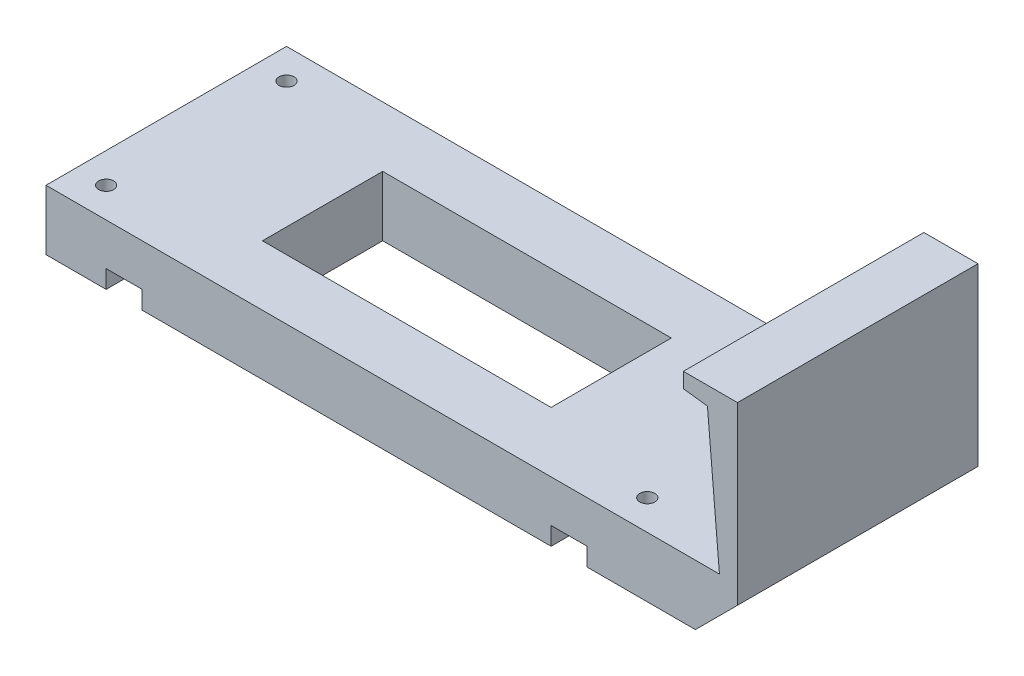
ISO-10303-21;
HEADER;
FILE_DESCRIPTION(('STEP AP214'),'2;1');
FILE_NAME('part.step','',(''),(''),'','','');
FILE_SCHEMA(('AUTOMOTIVE_DESIGN { 1 0 10303 214 1 1 1 1 }'));
ENDSEC;
DATA;
#1=APPLICATION_CONTEXT('core data for automotive mechanical design processes');
#2=APPLICATION_PROTOCOL_DEFINITION('international standard','automotive_design',2000,#1);
#3=PRODUCT_CONTEXT('',#1,'mechanical');
#4=PRODUCT('Part','Part','',(#3));
#5=PRODUCT_RELATED_PRODUCT_CATEGORY('part','',(#4));
#6=PRODUCT_DEFINITION_FORMATION('','',#4);
#7=PRODUCT_DEFINITION_CONTEXT('part definition',#1,'design');
#8=PRODUCT_DEFINITION('design','',#6,#7);
#9=PRODUCT_DEFINITION_SHAPE('','',#8);
#10=(LENGTH_UNIT() NAMED_UNIT(*) SI_UNIT(.MILLI.,.METRE.));
#11=(NAMED_UNIT(*) PLANE_ANGLE_UNIT() SI_UNIT($,.RADIAN.));
#12=(NAMED_UNIT(*) SI_UNIT($,.STERADIAN.) SOLID_ANGLE_UNIT());
#13=UNCERTAINTY_MEASURE_WITH_UNIT(LENGTH_MEASURE(1.E-05),#10,'distance_accuracy_value','');
#14=(GEOMETRIC_REPRESENTATION_CONTEXT(3) GLOBAL_UNCERTAINTY_ASSIGNED_CONTEXT((#13)) GLOBAL_UNIT_ASSIGNED_CONTEXT((#10,
#11,#12)) REPRESENTATION_CONTEXT('',''));
#15=CARTESIAN_POINT('',(0.,0.,0.));
#16=DIRECTION('',(0.,0.,1.));
#17=DIRECTION('',(1.,0.,0.));
#18=AXIS2_PLACEMENT_3D('',#15,#16,#17);
#19=CARTESIAN_POINT('',(0.,10.,40.));
#20=DIRECTION('',(1.,0.,0.));
#21=DIRECTION('',(0.,1.,0.));
#22=AXIS2_PLACEMENT_3D('',#19,#20,#21);
#23=PLANE('',#22);
#24=DIRECTION('',(0.,-1.,0.));
#25=VECTOR('',#24,1.);
#26=CARTESIAN_POINT('',(0.,10.,0.));
#27=LINE('',#26,#25);
#28=CARTESIAN_POINT('',(0.,10.,0.));
#29=VERTEX_POINT('',#28);
#30=CARTESIAN_POINT('',(0.,0.,0.));
#31=VERTEX_POINT('',#30);
#32=EDGE_CURVE('E296',#29,#31,#27,.T.);
#33=ORIENTED_EDGE('',*,*,#32,.T.);
#34=DIRECTION('',(0.,0.,-1.));
#35=VECTOR('',#34,1.);
#36=CARTESIAN_POINT('',(0.,0.,40.));
#37=LINE('',#36,#35);
#38=CARTESIAN_POINT('',(0.,0.,40.));
#39=VERTEX_POINT('',#38);
#40=EDGE_CURVE('E11',#39,#31,#37,.T.);
#41=ORIENTED_EDGE('',*,*,#40,.F.);
#42=DIRECTION('',(0.,-1.,0.));
#43=VECTOR('',#42,1.);
#44=CARTESIAN_POINT('',(0.,10.,40.));
#45=LINE('',#44,#43);
#46=CARTESIAN_POINT('',(0.,10.,40.));
#47=VERTEX_POINT('',#46);
#48=EDGE_CURVE('E297',#47,#39,#45,.T.);
#49=ORIENTED_EDGE('',*,*,#48,.F.);
#50=DIRECTION('',(0.,0.,-1.));
#51=VECTOR('',#50,1.);
#52=CARTESIAN_POINT('',(0.,10.,40.));
#53=LINE('',#52,#51);
#54=EDGE_CURVE('E181',#47,#29,#53,.T.);
#55=ORIENTED_EDGE('',*,*,#54,.T.);
#56=EDGE_LOOP('',(#33,#41,#49,#55));
#57=FACE_BOUND('',#56,.T.);
#58=ADVANCED_FACE('F33',(#57),#23,.F.);
#59=CARTESIAN_POINT('',(0.,0.,40.));
#60=DIRECTION('',(0.,1.,0.));
#61=DIRECTION('',(0.,0.,1.));
#62=AXIS2_PLACEMENT_3D('',#59,#60,#61);
#63=PLANE('',#62);
#64=CARTESIAN_POINT('',(5.,0.,5.));
#65=DIRECTION('',(0.,-1.,0.));
#66=DIRECTION('',(0.,0.,-1.));
#67=AXIS2_PLACEMENT_3D('',#64,#65,#66);
#68=CIRCLE('',#67,1.25);
#69=CARTESIAN_POINT('',(5.,0.,3.75));
#70=VERTEX_POINT('',#69);
#71=EDGE_CURVE('E251',#70,#70,#68,.T.);
#72=ORIENTED_EDGE('',*,*,#71,.F.);
#73=EDGE_LOOP('',(#72));
#74=FACE_BOUND('',#73,.T.);
#75=CARTESIAN_POINT('',(5.,0.,35.));
#76=DIRECTION('',(0.,-1.,0.));
#77=DIRECTION('',(0.,0.,-1.));
#78=AXIS2_PLACEMENT_3D('',#75,#76,#77);
#79=CIRCLE('',#78,1.25);
#80=CARTESIAN_POINT('',(5.,0.,33.75));
#81=VERTEX_POINT('',#80);
#82=EDGE_CURVE('E258',#81,#81,#79,.T.);
#83=ORIENTED_EDGE('',*,*,#82,.F.);
#84=EDGE_LOOP('',(#83));
#85=FACE_BOUND('',#84,.T.);
#86=DIRECTION('',(1.,0.,0.));
#87=VECTOR('',#86,1.);
#88=CARTESIAN_POINT('',(0.,0.,0.));
#89=LINE('',#88,#87);
#90=CARTESIAN_POINT('',(10.,0.,0.));
#91=VERTEX_POINT('',#90);
#92=EDGE_CURVE('E319',#31,#91,#89,.T.);
#93=ORIENTED_EDGE('',*,*,#92,.T.);
#94=DIRECTION('',(0.,0.,-1.));
#95=VECTOR('',#94,1.);
#96=CARTESIAN_POINT('',(10.,0.,40.));
#97=LINE('',#96,#95);
#98=CARTESIAN_POINT('',(10.,0.,40.));
#99=VERTEX_POINT('',#98);
#100=EDGE_CURVE('E40',#99,#91,#97,.T.);
#101=ORIENTED_EDGE('',*,*,#100,.F.);
#102=DIRECTION('',(1.,0.,0.));
#103=VECTOR('',#102,1.);
#104=CARTESIAN_POINT('',(0.,0.,40.));
#105=LINE('',#104,#103);
#106=EDGE_CURVE('E299',#39,#99,#105,.T.);
#107=ORIENTED_EDGE('',*,*,#106,.F.);
#108=ORIENTED_EDGE('',*,*,#40,.T.);
#109=EDGE_LOOP('',(#93,#101,#107,#108));
#110=FACE_BOUND('',#109,.T.);
#111=ADVANCED_FACE('F384',(#74,#85,#110),#63,.F.);
#112=CARTESIAN_POINT('',(10.,0.,40.));
#113=DIRECTION('',(-1.,0.,0.));
#114=DIRECTION('',(0.,0.,1.));
#115=AXIS2_PLACEMENT_3D('',#112,#113,#114);
#116=PLANE('',#115);
#117=DIRECTION('',(0.,1.,0.));
#118=VECTOR('',#117,1.);
#119=CARTESIAN_POINT('',(10.,0.,0.));
#120=LINE('',#119,#118);
#121=CARTESIAN_POINT('',(10.,3.,0.));
#122=VERTEX_POINT('',#121);
#123=EDGE_CURVE('E321',#91,#122,#120,.T.);
#124=ORIENTED_EDGE('',*,*,#123,.T.);
#125=DIRECTION('',(0.,0.,-1.));
#126=VECTOR('',#125,1.);
#127=CARTESIAN_POINT('',(10.,3.,40.));
#128=LINE('',#127,#126);
#129=CARTESIAN_POINT('',(10.,3.,40.));
#130=VERTEX_POINT('',#129);
#131=EDGE_CURVE('E357',#130,#122,#128,.T.);
#132=ORIENTED_EDGE('',*,*,#131,.F.);
#133=DIRECTION('',(0.,1.,0.));
#134=VECTOR('',#133,1.);
#135=CARTESIAN_POINT('',(10.,0.,40.));
#136=LINE('',#135,#134);
#137=EDGE_CURVE('E302',#99,#130,#136,.T.);
#138=ORIENTED_EDGE('',*,*,#137,.F.);
#139=ORIENTED_EDGE('',*,*,#100,.T.);
#140=EDGE_LOOP('',(#124,#132,#138,#139));
#141=FACE_BOUND('',#140,.T.);
#142=ADVANCED_FACE('F364',(#141),#116,.F.);
#143=CARTESIAN_POINT('',(10.,3.,40.));
#144=DIRECTION('',(0.,1.,0.));
#145=DIRECTION('',(0.,0.,1.));
#146=AXIS2_PLACEMENT_3D('',#143,#144,#145);
#147=PLANE('',#146);
#148=DIRECTION('',(1.,0.,0.));
#149=VECTOR('',#148,1.);
#150=CARTESIAN_POINT('',(10.,3.,0.));
#151=LINE('',#150,#149);
#152=CARTESIAN_POINT('',(16.,3.,0.));
#153=VERTEX_POINT('',#152);
#154=EDGE_CURVE('E323',#122,#153,#151,.T.);
#155=ORIENTED_EDGE('',*,*,#154,.T.);
#156=DIRECTION('',(0.,0.,-1.));
#157=VECTOR('',#156,1.);
#158=CARTESIAN_POINT('',(16.,3.,40.));
#159=LINE('',#158,#157);
#160=CARTESIAN_POINT('',(16.,3.,40.));
#161=VERTEX_POINT('',#160);
#162=EDGE_CURVE('E354',#161,#153,#159,.T.);
#163=ORIENTED_EDGE('',*,*,#162,.F.);
#164=DIRECTION('',(1.,0.,0.));
#165=VECTOR('',#164,1.);
#166=CARTESIAN_POINT('',(10.,3.,40.));
#167=LINE('',#166,#165);
#168=EDGE_CURVE('E304',#130,#161,#167,.T.);
#169=ORIENTED_EDGE('',*,*,#168,.F.);
#170=ORIENTED_EDGE('',*,*,#131,.T.);
#171=EDGE_LOOP('',(#155,#163,#169,#170));
#172=FACE_BOUND('',#171,.T.);
#173=ADVANCED_FACE('F375',(#172),#147,.F.);
#174=CARTESIAN_POINT('',(16.,3.,40.));
#175=DIRECTION('',(1.,0.,0.));
#176=DIRECTION('',(0.,0.,-1.));
#177=AXIS2_PLACEMENT_3D('',#174,#175,#176);
#178=PLANE('',#177);
#179=DIRECTION('',(0.,-1.,0.));
#180=VECTOR('',#179,1.);
#181=CARTESIAN_POINT('',(16.,3.,0.));
#182=LINE('',#181,#180);
#183=CARTESIAN_POINT('',(16.,0.,0.));
#184=VERTEX_POINT('',#183);
#185=EDGE_CURVE('E325',#153,#184,#182,.T.);
#186=ORIENTED_EDGE('',*,*,#185,.T.);
#187=DIRECTION('',(0.,0.,-1.));
#188=VECTOR('',#187,1.);
#189=CARTESIAN_POINT('',(16.,0.,40.));
#190=LINE('',#189,#188);
#191=CARTESIAN_POINT('',(16.,0.,40.));
#192=VERTEX_POINT('',#191);
#193=EDGE_CURVE('E351',#192,#184,#190,.T.);
#194=ORIENTED_EDGE('',*,*,#193,.F.);
#195=DIRECTION('',(0.,-1.,0.));
#196=VECTOR('',#195,1.);
#197=CARTESIAN_POINT('',(16.,3.,40.));
#198=LINE('',#197,#196);
#199=EDGE_CURVE('E306',#161,#192,#198,.T.);
#200=ORIENTED_EDGE('',*,*,#199,.F.);
#201=ORIENTED_EDGE('',*,*,#162,.T.);
#202=EDGE_LOOP('',(#186,#194,#200,#201));
#203=FACE_BOUND('',#202,.T.);
#204=ADVANCED_FACE('F379',(#203),#178,.F.);
#205=CARTESIAN_POINT('',(16.,0.,40.));
#206=DIRECTION('',(0.,1.,0.));
#207=DIRECTION('',(0.,0.,1.));
#208=AXIS2_PLACEMENT_3D('',#205,#206,#207);
#209=PLANE('',#208);
#210=DIRECTION('',(1.,0.,0.));
#211=VECTOR('',#210,1.);
#212=CARTESIAN_POINT('',(26.,0.,10.));
#213=LINE('',#212,#211);
#214=CARTESIAN_POINT('',(26.,0.,10.));
#215=VERTEX_POINT('',#214);
#216=CARTESIAN_POINT('',(74.,0.,10.));
#217=VERTEX_POINT('',#216);
#218=EDGE_CURVE('E269',#215,#217,#213,.T.);
#219=ORIENTED_EDGE('',*,*,#218,.F.);
#220=DIRECTION('',(0.,0.,-1.));
#221=VECTOR('',#220,1.);
#222=CARTESIAN_POINT('',(26.,0.,10.));
#223=LINE('',#222,#221);
#224=CARTESIAN_POINT('',(26.,0.,30.));
#225=VERTEX_POINT('',#224);
#226=EDGE_CURVE('E272',#225,#215,#223,.T.);
#227=ORIENTED_EDGE('',*,*,#226,.F.);
#228=DIRECTION('',(-1.,0.,0.));
#229=VECTOR('',#228,1.);
#230=CARTESIAN_POINT('',(26.,0.,30.));
#231=LINE('',#230,#229);
#232=CARTESIAN_POINT('',(74.,0.,30.));
#233=VERTEX_POINT('',#232);
#234=EDGE_CURVE('E288',#233,#225,#231,.T.);
#235=ORIENTED_EDGE('',*,*,#234,.F.);
#236=DIRECTION('',(0.,0.,1.));
#237=VECTOR('',#236,1.);
#238=CARTESIAN_POINT('',(74.,0.,10.));
#239=LINE('',#238,#237);
#240=EDGE_CURVE('E47',#217,#233,#239,.T.);
#241=ORIENTED_EDGE('',*,*,#240,.F.);
#242=EDGE_LOOP('',(#219,#227,#235,#241));
#243=FACE_BOUND('',#242,.T.);
#244=DIRECTION('',(1.,0.,0.));
#245=VECTOR('',#244,1.);
#246=CARTESIAN_POINT('',(16.,0.,0.));
#247=LINE('',#246,#245);
#248=CARTESIAN_POINT('',(84.,0.,0.));
#249=VERTEX_POINT('',#248);
#250=EDGE_CURVE('E327',#184,#249,#247,.T.);
#251=ORIENTED_EDGE('',*,*,#250,.T.);
#252=DIRECTION('',(0.,0.,-1.));
#253=VECTOR('',#252,1.);
#254=CARTESIAN_POINT('',(84.,0.,40.));
#255=LINE('',#254,#253);
#256=CARTESIAN_POINT('',(84.,0.,40.));
#257=VERTEX_POINT('',#256);
#258=EDGE_CURVE('E348',#257,#249,#255,.T.);
#259=ORIENTED_EDGE('',*,*,#258,.F.);
#260=DIRECTION('',(1.,0.,0.));
#261=VECTOR('',#260,1.);
#262=CARTESIAN_POINT('',(16.,0.,40.));
#263=LINE('',#262,#261);
#264=EDGE_CURVE('E308',#192,#257,#263,.T.);
#265=ORIENTED_EDGE('',*,*,#264,.F.);
#266=ORIENTED_EDGE('',*,*,#193,.T.);
#267=EDGE_LOOP('',(#251,#259,#265,#266));
#268=FACE_BOUND('',#267,.T.);
#269=ADVANCED_FACE('F425',(#243,#268),#209,.F.);
#270=CARTESIAN_POINT('',(84.,0.,40.));
#271=DIRECTION('',(-1.,0.,0.));
#272=DIRECTION('',(0.,0.,1.));
#273=AXIS2_PLACEMENT_3D('',#270,#271,#272);
#274=PLANE('',#273);
#275=DIRECTION('',(0.,1.,0.));
#276=VECTOR('',#275,1.);
#277=CARTESIAN_POINT('',(84.,0.,0.));
#278=LINE('',#277,#276);
#279=CARTESIAN_POINT('',(84.,3.,0.));
#280=VERTEX_POINT('',#279);
#281=EDGE_CURVE('E329',#249,#280,#278,.T.);
#282=ORIENTED_EDGE('',*,*,#281,.T.);
#283=DIRECTION('',(0.,0.,-1.));
#284=VECTOR('',#283,1.);
#285=CARTESIAN_POINT('',(84.,3.,40.));
#286=LINE('',#285,#284);
#287=CARTESIAN_POINT('',(84.,3.,40.));
#288=VERTEX_POINT('',#287);
#289=EDGE_CURVE('E345',#288,#280,#286,.T.);
#290=ORIENTED_EDGE('',*,*,#289,.F.);
#291=DIRECTION('',(0.,1.,0.));
#292=VECTOR('',#291,1.);
#293=CARTESIAN_POINT('',(84.,0.,40.));
#294=LINE('',#293,#292);
#295=EDGE_CURVE('E310',#257,#288,#294,.T.);
#296=ORIENTED_EDGE('',*,*,#295,.F.);
#297=ORIENTED_EDGE('',*,*,#258,.T.);
#298=EDGE_LOOP('',(#282,#290,#296,#297));
#299=FACE_BOUND('',#298,.T.);
#300=ADVANCED_FACE('F423',(#299),#274,.F.);
#301=CARTESIAN_POINT('',(84.,3.,40.));
#302=DIRECTION('',(0.,1.,0.));
#303=DIRECTION('',(-1.,0.,0.));
#304=AXIS2_PLACEMENT_3D('',#301,#302,#303);
#305=PLANE('',#304);
#306=DIRECTION('',(1.,0.,0.));
#307=VECTOR('',#306,1.);
#308=CARTESIAN_POINT('',(84.,3.,0.));
#309=LINE('',#308,#307);
#310=CARTESIAN_POINT('',(90.,3.,0.));
#311=VERTEX_POINT('',#310);
#312=EDGE_CURVE('E331',#280,#311,#309,.T.);
#313=ORIENTED_EDGE('',*,*,#312,.T.);
#314=DIRECTION('',(0.,0.,-1.));
#315=VECTOR('',#314,1.);
#316=CARTESIAN_POINT('',(90.,3.,40.));
#317=LINE('',#316,#315);
#318=CARTESIAN_POINT('',(90.,3.,40.));
#319=VERTEX_POINT('',#318);
#320=EDGE_CURVE('E342',#319,#311,#317,.T.);
#321=ORIENTED_EDGE('',*,*,#320,.F.);
#322=DIRECTION('',(1.,0.,0.));
#323=VECTOR('',#322,1.);
#324=CARTESIAN_POINT('',(84.,3.,40.));
#325=LINE('',#324,#323);
#326=EDGE_CURVE('E312',#288,#319,#325,.T.);
#327=ORIENTED_EDGE('',*,*,#326,.F.);
#328=ORIENTED_EDGE('',*,*,#289,.T.);
#329=EDGE_LOOP('',(#313,#321,#327,#328));
#330=FACE_BOUND('',#329,.T.);
#331=ADVANCED_FACE('F419',(#330),#305,.F.);
#332=CARTESIAN_POINT('',(90.,3.,40.));
#333=DIRECTION('',(1.,0.,0.));
#334=DIRECTION('',(0.,0.,-1.));
#335=AXIS2_PLACEMENT_3D('',#332,#333,#334);
#336=PLANE('',#335);
#337=DIRECTION('',(0.,-1.,0.));
#338=VECTOR('',#337,1.);
#339=CARTESIAN_POINT('',(90.,3.,0.));
#340=LINE('',#339,#338);
#341=CARTESIAN_POINT('',(90.,0.,0.));
#342=VERTEX_POINT('',#341);
#343=EDGE_CURVE('E333',#311,#342,#340,.T.);
#344=ORIENTED_EDGE('',*,*,#343,.T.);
#345=DIRECTION('',(0.,0.,-1.));
#346=VECTOR('',#345,1.);
#347=CARTESIAN_POINT('',(90.,0.,40.));
#348=LINE('',#347,#346);
#349=CARTESIAN_POINT('',(90.,0.,40.));
#350=VERTEX_POINT('',#349);
#351=EDGE_CURVE('E339',#350,#342,#348,.T.);
#352=ORIENTED_EDGE('',*,*,#351,.F.);
#353=DIRECTION('',(0.,-1.,0.));
#354=VECTOR('',#353,1.);
#355=CARTESIAN_POINT('',(90.,3.,40.));
#356=LINE('',#355,#354);
#357=EDGE_CURVE('E314',#319,#350,#356,.T.);
#358=ORIENTED_EDGE('',*,*,#357,.F.);
#359=ORIENTED_EDGE('',*,*,#320,.T.);
#360=EDGE_LOOP('',(#344,#352,#358,#359));
#361=FACE_BOUND('',#360,.T.);
#362=ADVANCED_FACE('F414',(#361),#336,.F.);
#363=CARTESIAN_POINT('',(90.,0.,40.));
#364=DIRECTION('',(0.,1.,0.));
#365=DIRECTION('',(0.,0.,1.));
#366=AXIS2_PLACEMENT_3D('',#363,#364,#365);
#367=PLANE('',#366);
#368=CARTESIAN_POINT('',(95.,0.,35.));
#369=DIRECTION('',(0.,-1.,0.));
#370=DIRECTION('',(0.,0.,-1.));
#371=AXIS2_PLACEMENT_3D('',#368,#369,#370);
#372=CIRCLE('',#371,1.25);
#373=CARTESIAN_POINT('',(95.,0.,33.75));
#374=VERTEX_POINT('',#373);
#375=EDGE_CURVE('E250',#374,#374,#372,.T.);
#376=ORIENTED_EDGE('',*,*,#375,.F.);
#377=EDGE_LOOP('',(#376));
#378=FACE_BOUND('',#377,.T.);
#379=CARTESIAN_POINT('',(95.,0.,5.));
#380=DIRECTION('',(0.,-1.,0.));
#381=DIRECTION('',(0.,0.,-1.));
#382=AXIS2_PLACEMENT_3D('',#379,#380,#381);
#383=CIRCLE('',#382,1.25);
#384=CARTESIAN_POINT('',(95.,0.,3.75));
#385=VERTEX_POINT('',#384);
#386=EDGE_CURVE('E235',#385,#385,#383,.T.);
#387=ORIENTED_EDGE('',*,*,#386,.F.);
#388=EDGE_LOOP('',(#387));
#389=FACE_BOUND('',#388,.T.);
#390=DIRECTION('',(1.,0.,0.));
#391=VECTOR('',#390,1.);
#392=CARTESIAN_POINT('',(90.,0.,0.));
#393=LINE('',#392,#391);
#394=CARTESIAN_POINT('',(108.,0.,0.));
#395=VERTEX_POINT('',#394);
#396=EDGE_CURVE('E335',#342,#395,#393,.T.);
#397=ORIENTED_EDGE('',*,*,#396,.T.);
#398=DIRECTION('',(0.,0.,-1.));
#399=VECTOR('',#398,1.);
#400=CARTESIAN_POINT('',(108.,0.,40.));
#401=LINE('',#400,#399);
#402=CARTESIAN_POINT('',(108.,0.,40.));
#403=VERTEX_POINT('',#402);
#404=EDGE_CURVE('E232',#403,#395,#401,.T.);
#405=ORIENTED_EDGE('',*,*,#404,.F.);
#406=DIRECTION('',(1.,0.,0.));
#407=VECTOR('',#406,1.);
#408=CARTESIAN_POINT('',(90.,0.,40.));
#409=LINE('',#408,#407);
#410=EDGE_CURVE('E186',#350,#403,#409,.T.);
#411=ORIENTED_EDGE('',*,*,#410,.F.);
#412=ORIENTED_EDGE('',*,*,#351,.T.);
#413=EDGE_LOOP('',(#397,#405,#411,#412));
#414=FACE_BOUND('',#413,.T.);
#415=ADVANCED_FACE('F408',(#378,#389,#414),#367,.F.);
#416=CARTESIAN_POINT('',(0.,10.,40.));
#417=DIRECTION('',(0.,-1.,0.));
#418=DIRECTION('',(0.,0.,-1.));
#419=AXIS2_PLACEMENT_3D('',#416,#417,#418);
#420=PLANE('',#419);
#421=CARTESIAN_POINT('',(5.,10.,5.));
#422=DIRECTION('',(0.,-1.,0.));
#423=DIRECTION('',(0.,0.,-1.));
#424=AXIS2_PLACEMENT_3D('',#421,#422,#423);
#425=CIRCLE('',#424,1.25);
#426=CARTESIAN_POINT('',(5.,10.,3.75));
#427=VERTEX_POINT('',#426);
#428=EDGE_CURVE('E254',#427,#427,#425,.F.);
#429=ORIENTED_EDGE('',*,*,#428,.F.);
#430=EDGE_LOOP('',(#429));
#431=FACE_BOUND('',#430,.T.);
#432=CARTESIAN_POINT('',(95.,10.,35.));
#433=DIRECTION('',(0.,-1.,0.));
#434=DIRECTION('',(0.,0.,-1.));
#435=AXIS2_PLACEMENT_3D('',#432,#433,#434);
#436=CIRCLE('',#435,1.25);
#437=CARTESIAN_POINT('',(95.,10.,33.75));
#438=VERTEX_POINT('',#437);
#439=EDGE_CURVE('E255',#438,#438,#436,.F.);
#440=ORIENTED_EDGE('',*,*,#439,.F.);
#441=EDGE_LOOP('',(#440));
#442=FACE_BOUND('',#441,.T.);
#443=CARTESIAN_POINT('',(95.,10.,5.));
#444=DIRECTION('',(0.,-1.,0.));
#445=DIRECTION('',(0.,0.,-1.));
#446=AXIS2_PLACEMENT_3D('',#443,#444,#445);
#447=CIRCLE('',#446,1.25);
#448=CARTESIAN_POINT('',(95.,10.,3.75));
#449=VERTEX_POINT('',#448);
#450=EDGE_CURVE('E247',#449,#449,#447,.F.);
#451=ORIENTED_EDGE('',*,*,#450,.F.);
#452=EDGE_LOOP('',(#451));
#453=FACE_BOUND('',#452,.T.);
#454=CARTESIAN_POINT('',(5.,10.,35.));
#455=DIRECTION('',(0.,-1.,0.));
#456=DIRECTION('',(0.,0.,-1.));
#457=AXIS2_PLACEMENT_3D('',#454,#455,#456);
#458=CIRCLE('',#457,1.25);
#459=CARTESIAN_POINT('',(5.,10.,33.75));
#460=VERTEX_POINT('',#459);
#461=EDGE_CURVE('E265',#460,#460,#458,.F.);
#462=ORIENTED_EDGE('',*,*,#461,.F.);
#463=EDGE_LOOP('',(#462));
#464=FACE_BOUND('',#463,.T.);
#465=DIRECTION('',(1.,0.,0.));
#466=VECTOR('',#465,1.);
#467=CARTESIAN_POINT('',(26.,10.,30.));
#468=LINE('',#467,#466);
#469=CARTESIAN_POINT('',(26.,10.,30.));
#470=VERTEX_POINT('',#469);
#471=CARTESIAN_POINT('',(74.,10.,30.));
#472=VERTEX_POINT('',#471);
#473=EDGE_CURVE('E276',#470,#472,#468,.T.);
#474=ORIENTED_EDGE('',*,*,#473,.F.);
#475=DIRECTION('',(0.,0.,1.));
#476=VECTOR('',#475,1.);
#477=CARTESIAN_POINT('',(26.,10.,10.));
#478=LINE('',#477,#476);
#479=CARTESIAN_POINT('',(26.,10.,10.));
#480=VERTEX_POINT('',#479);
#481=EDGE_CURVE('E55',#480,#470,#478,.T.);
#482=ORIENTED_EDGE('',*,*,#481,.F.);
#483=DIRECTION('',(-1.,0.,0.));
#484=VECTOR('',#483,1.);
#485=CARTESIAN_POINT('',(26.,10.,10.));
#486=LINE('',#485,#484);
#487=CARTESIAN_POINT('',(74.,10.,10.));
#488=VERTEX_POINT('',#487);
#489=EDGE_CURVE('E282',#488,#480,#486,.T.);
#490=ORIENTED_EDGE('',*,*,#489,.F.);
#491=DIRECTION('',(0.,0.,-1.));
#492=VECTOR('',#491,1.);
#493=CARTESIAN_POINT('',(74.,10.,10.));
#494=LINE('',#493,#492);
#495=EDGE_CURVE('E279',#472,#488,#494,.T.);
#496=ORIENTED_EDGE('',*,*,#495,.F.);
#497=EDGE_LOOP('',(#474,#482,#490,#496));
#498=FACE_BOUND('',#497,.T.);
#499=DIRECTION('',(-1.,0.,0.));
#500=VECTOR('',#499,1.);
#501=CARTESIAN_POINT('',(0.,10.,0.));
#502=LINE('',#501,#500);
#503=CARTESIAN_POINT('',(112.,10.,0.));
#504=VERTEX_POINT('',#503);
#505=EDGE_CURVE('E300',#504,#29,#502,.T.);
#506=ORIENTED_EDGE('',*,*,#505,.T.);
#507=ORIENTED_EDGE('',*,*,#54,.F.);
#508=DIRECTION('',(-1.,0.,0.));
#509=VECTOR('',#508,1.);
#510=CARTESIAN_POINT('',(0.,10.,40.));
#511=LINE('',#510,#509);
#512=CARTESIAN_POINT('',(112.,10.,40.));
#513=VERTEX_POINT('',#512);
#514=EDGE_CURVE('E175',#513,#47,#511,.T.);
#515=ORIENTED_EDGE('',*,*,#514,.F.);
#516=DIRECTION('',(0.,0.,-1.));
#517=VECTOR('',#516,1.);
#518=CARTESIAN_POINT('',(112.,10.,40.));
#519=LINE('',#518,#517);
#520=EDGE_CURVE('E178',#513,#504,#519,.T.);
#521=ORIENTED_EDGE('',*,*,#520,.T.);
#522=EDGE_LOOP('',(#506,#507,#515,#521));
#523=FACE_BOUND('',#522,.T.);
#524=ADVANCED_FACE('F177',(#431,#442,#453,#464,#498,#523),#420,.F.);
#525=CARTESIAN_POINT('',(0.,0.,40.));
#526=DIRECTION('',(0.,0.,1.));
#527=DIRECTION('',(1.,0.,0.));
#528=AXIS2_PLACEMENT_3D('',#525,#526,#527);
#529=PLANE('',#528);
#530=ORIENTED_EDGE('',*,*,#48,.T.);
#531=ORIENTED_EDGE('',*,*,#106,.T.);
#532=ORIENTED_EDGE('',*,*,#137,.T.);
#533=ORIENTED_EDGE('',*,*,#168,.T.);
#534=ORIENTED_EDGE('',*,*,#199,.T.);
#535=ORIENTED_EDGE('',*,*,#264,.T.);
#536=ORIENTED_EDGE('',*,*,#295,.T.);
#537=ORIENTED_EDGE('',*,*,#326,.T.);
#538=ORIENTED_EDGE('',*,*,#357,.T.);
#539=ORIENTED_EDGE('',*,*,#410,.T.);
#540=DIRECTION('',(-0.707106781186546,-0.707106781186548,0.));
#541=VECTOR('',#540,1.);
#542=CARTESIAN_POINT('',(115.,7.,40.));
#543=LINE('',#542,#541);
#544=CARTESIAN_POINT('',(115.,7.,40.));
#545=VERTEX_POINT('',#544);
#546=EDGE_CURVE('E195',#545,#403,#543,.T.);
#547=ORIENTED_EDGE('',*,*,#546,.F.);
#548=DIRECTION('',(0.,-1.,0.));
#549=VECTOR('',#548,1.);
#550=CARTESIAN_POINT('',(115.,36.2,40.));
#551=LINE('',#550,#549);
#552=CARTESIAN_POINT('',(115.,36.2,40.));
#553=VERTEX_POINT('',#552);
#554=EDGE_CURVE('E215',#553,#545,#551,.T.);
#555=ORIENTED_EDGE('',*,*,#554,.F.);
#556=DIRECTION('',(1.,0.,0.));
#557=VECTOR('',#556,1.);
#558=CARTESIAN_POINT('',(115.,36.2,40.));
#559=LINE('',#558,#557);
#560=CARTESIAN_POINT('',(106.,36.2,40.));
#561=VERTEX_POINT('',#560);
#562=EDGE_CURVE('E212',#561,#553,#559,.T.);
#563=ORIENTED_EDGE('',*,*,#562,.F.);
#564=DIRECTION('',(0.,1.,0.));
#565=VECTOR('',#564,1.);
#566=CARTESIAN_POINT('',(106.,36.2,40.));
#567=LINE('',#566,#565);
#568=CARTESIAN_POINT('',(106.,33.7,40.));
#569=VERTEX_POINT('',#568);
#570=EDGE_CURVE('E204',#569,#561,#567,.T.);
#571=ORIENTED_EDGE('',*,*,#570,.F.);
#572=DIRECTION('',(-0.992277876713668,0.124034734589208,0.));
#573=VECTOR('',#572,1.);
#574=CARTESIAN_POINT('',(110.,33.2,40.));
#575=LINE('',#574,#573);
#576=CARTESIAN_POINT('',(110.,33.2,40.));
#577=VERTEX_POINT('',#576);
#578=EDGE_CURVE('E201',#577,#569,#575,.T.);
#579=ORIENTED_EDGE('',*,*,#578,.F.);
#580=DIRECTION('',(-0.0858883421530121,0.996304768974939,0.));
#581=VECTOR('',#580,1.);
#582=CARTESIAN_POINT('',(112.,10.,40.));
#583=LINE('',#582,#581);
#584=EDGE_CURVE('E191',#513,#577,#583,.T.);
#585=ORIENTED_EDGE('',*,*,#584,.F.);
#586=ORIENTED_EDGE('',*,*,#514,.T.);
#587=EDGE_LOOP('',(#530,#531,#532,#533,#534,#535,#536,#537,#538,#539,#547,#555,#563,#571,#579,
#585,#586));
#588=FACE_BOUND('',#587,.T.);
#589=ADVANCED_FACE('F198',(#588),#529,.T.);
#590=CARTESIAN_POINT('',(0.,0.,0.));
#591=DIRECTION('',(0.,0.,1.));
#592=DIRECTION('',(1.,0.,0.));
#593=AXIS2_PLACEMENT_3D('',#590,#591,#592);
#594=PLANE('',#593);
#595=ORIENTED_EDGE('',*,*,#32,.F.);
#596=ORIENTED_EDGE('',*,*,#505,.F.);
#597=DIRECTION('',(-0.0858883421530121,0.996304768974939,0.));
#598=VECTOR('',#597,1.);
#599=CARTESIAN_POINT('',(112.,10.,0.));
#600=LINE('',#599,#598);
#601=CARTESIAN_POINT('',(110.,33.2,0.));
#602=VERTEX_POINT('',#601);
#603=EDGE_CURVE('E193',#504,#602,#600,.T.);
#604=ORIENTED_EDGE('',*,*,#603,.T.);
#605=DIRECTION('',(-0.992277876713668,0.124034734589208,0.));
#606=VECTOR('',#605,1.);
#607=CARTESIAN_POINT('',(110.,33.2,0.));
#608=LINE('',#607,#606);
#609=CARTESIAN_POINT('',(106.,33.7,0.));
#610=VERTEX_POINT('',#609);
#611=EDGE_CURVE('E221',#602,#610,#608,.T.);
#612=ORIENTED_EDGE('',*,*,#611,.T.);
#613=DIRECTION('',(0.,1.,0.));
#614=VECTOR('',#613,1.);
#615=CARTESIAN_POINT('',(106.,36.2,0.));
#616=LINE('',#615,#614);
#617=CARTESIAN_POINT('',(106.,36.2,0.));
#618=VERTEX_POINT('',#617);
#619=EDGE_CURVE('E224',#610,#618,#616,.T.);
#620=ORIENTED_EDGE('',*,*,#619,.T.);
#621=DIRECTION('',(1.,0.,0.));
#622=VECTOR('',#621,1.);
#623=CARTESIAN_POINT('',(115.,36.2,0.));
#624=LINE('',#623,#622);
#625=CARTESIAN_POINT('',(115.,36.2,0.));
#626=VERTEX_POINT('',#625);
#627=EDGE_CURVE('E227',#618,#626,#624,.T.);
#628=ORIENTED_EDGE('',*,*,#627,.T.);
#629=DIRECTION('',(0.,-1.,0.));
#630=VECTOR('',#629,1.);
#631=CARTESIAN_POINT('',(115.,36.2,0.));
#632=LINE('',#631,#630);
#633=CARTESIAN_POINT('',(115.,7.,0.));
#634=VERTEX_POINT('',#633);
#635=EDGE_CURVE('E207',#626,#634,#632,.T.);
#636=ORIENTED_EDGE('',*,*,#635,.T.);
#637=DIRECTION('',(-0.707106781186546,-0.707106781186548,0.));
#638=VECTOR('',#637,1.);
#639=CARTESIAN_POINT('',(115.,7.,0.));
#640=LINE('',#639,#638);
#641=EDGE_CURVE('E202',#634,#395,#640,.T.);
#642=ORIENTED_EDGE('',*,*,#641,.T.);
#643=ORIENTED_EDGE('',*,*,#396,.F.);
#644=ORIENTED_EDGE('',*,*,#343,.F.);
#645=ORIENTED_EDGE('',*,*,#312,.F.);
#646=ORIENTED_EDGE('',*,*,#281,.F.);
#647=ORIENTED_EDGE('',*,*,#250,.F.);
#648=ORIENTED_EDGE('',*,*,#185,.F.);
#649=ORIENTED_EDGE('',*,*,#154,.F.);
#650=ORIENTED_EDGE('',*,*,#123,.F.);
#651=ORIENTED_EDGE('',*,*,#92,.F.);
#652=EDGE_LOOP('',(#595,#596,#604,#612,#620,#628,#636,#642,#643,#644,#645,#646,#647,#648,#649,
#650,#651));
#653=FACE_BOUND('',#652,.T.);
#654=ADVANCED_FACE('F370',(#653),#594,.F.);
#655=CARTESIAN_POINT('',(26.,-0.000999999999999265,10.));
#656=DIRECTION('',(-1.,0.,0.));
#657=DIRECTION('',(0.,0.,1.));
#658=AXIS2_PLACEMENT_3D('',#655,#656,#657);
#659=PLANE('',#658);
#660=ORIENTED_EDGE('',*,*,#226,.T.);
#661=DIRECTION('',(0.,1.,0.));
#662=VECTOR('',#661,1.);
#663=CARTESIAN_POINT('',(26.,-0.000999999999999265,10.));
#664=LINE('',#663,#662);
#665=EDGE_CURVE('E286',#215,#480,#664,.T.);
#666=ORIENTED_EDGE('',*,*,#665,.T.);
#667=ORIENTED_EDGE('',*,*,#481,.T.);
#668=DIRECTION('',(0.,1.,0.));
#669=VECTOR('',#668,1.);
#670=CARTESIAN_POINT('',(26.,-0.000999999999999265,30.));
#671=LINE('',#670,#669);
#672=EDGE_CURVE('E285',#225,#470,#671,.T.);
#673=ORIENTED_EDGE('',*,*,#672,.F.);
#674=EDGE_LOOP('',(#660,#666,#667,#673));
#675=FACE_BOUND('',#674,.T.);
#676=ADVANCED_FACE('F490',(#675),#659,.F.);
#677=CARTESIAN_POINT('',(26.,-0.000999999999999265,10.));
#678=DIRECTION('',(0.,0.,-1.));
#679=DIRECTION('',(-1.,0.,0.));
#680=AXIS2_PLACEMENT_3D('',#677,#678,#679);
#681=PLANE('',#680);
#682=ORIENTED_EDGE('',*,*,#218,.T.);
#683=DIRECTION('',(0.,1.,0.));
#684=VECTOR('',#683,1.);
#685=CARTESIAN_POINT('',(74.,-0.000999999999999265,10.));
#686=LINE('',#685,#684);
#687=EDGE_CURVE('E289',#217,#488,#686,.T.);
#688=ORIENTED_EDGE('',*,*,#687,.T.);
#689=ORIENTED_EDGE('',*,*,#489,.T.);
#690=ORIENTED_EDGE('',*,*,#665,.F.);
#691=EDGE_LOOP('',(#682,#688,#689,#690));
#692=FACE_BOUND('',#691,.T.);
#693=ADVANCED_FACE('F495',(#692),#681,.F.);
#694=CARTESIAN_POINT('',(74.,-0.000999999999999265,10.));
#695=DIRECTION('',(1.,0.,0.));
#696=DIRECTION('',(0.,0.,-1.));
#697=AXIS2_PLACEMENT_3D('',#694,#695,#696);
#698=PLANE('',#697);
#699=ORIENTED_EDGE('',*,*,#240,.T.);
#700=DIRECTION('',(0.,1.,0.));
#701=VECTOR('',#700,1.);
#702=CARTESIAN_POINT('',(74.,-0.000999999999999265,30.));
#703=LINE('',#702,#701);
#704=EDGE_CURVE('E291',#233,#472,#703,.T.);
#705=ORIENTED_EDGE('',*,*,#704,.T.);
#706=ORIENTED_EDGE('',*,*,#495,.T.);
#707=ORIENTED_EDGE('',*,*,#687,.F.);
#708=EDGE_LOOP('',(#699,#705,#706,#707));
#709=FACE_BOUND('',#708,.T.);
#710=ADVANCED_FACE('F506',(#709),#698,.F.);
#711=CARTESIAN_POINT('',(26.,-0.000999999999999265,30.));
#712=DIRECTION('',(0.,0.,1.));
#713=DIRECTION('',(1.,0.,0.));
#714=AXIS2_PLACEMENT_3D('',#711,#712,#713);
#715=PLANE('',#714);
#716=ORIENTED_EDGE('',*,*,#234,.T.);
#717=ORIENTED_EDGE('',*,*,#672,.T.);
#718=ORIENTED_EDGE('',*,*,#473,.T.);
#719=ORIENTED_EDGE('',*,*,#704,.F.);
#720=EDGE_LOOP('',(#716,#717,#718,#719));
#721=FACE_BOUND('',#720,.T.);
#722=ADVANCED_FACE('F516',(#721),#715,.F.);
#723=CARTESIAN_POINT('',(5.,10.001,35.));
#724=DIRECTION('',(0.,-1.,0.));
#725=DIRECTION('',(0.,0.,-1.));
#726=AXIS2_PLACEMENT_3D('',#723,#724,#725);
#727=CYLINDRICAL_SURFACE('',#726,1.25);
#728=ORIENTED_EDGE('',*,*,#82,.T.);
#729=EDGE_LOOP('',(#728));
#730=FACE_BOUND('',#729,.T.);
#731=ORIENTED_EDGE('',*,*,#461,.T.);
#732=EDGE_LOOP('',(#731));
#733=FACE_BOUND('',#732,.T.);
#734=ADVANCED_FACE('F524',(#730,#733),#727,.F.);
#735=CARTESIAN_POINT('',(95.,10.001,5.));
#736=DIRECTION('',(0.,-1.,0.));
#737=DIRECTION('',(0.,0.,-1.));
#738=AXIS2_PLACEMENT_3D('',#735,#736,#737);
#739=CYLINDRICAL_SURFACE('',#738,1.25);
#740=ORIENTED_EDGE('',*,*,#386,.T.);
#741=EDGE_LOOP('',(#740));
#742=FACE_BOUND('',#741,.T.);
#743=ORIENTED_EDGE('',*,*,#450,.T.);
#744=EDGE_LOOP('',(#743));
#745=FACE_BOUND('',#744,.T.);
#746=ADVANCED_FACE('F541',(#742,#745),#739,.F.);
#747=CARTESIAN_POINT('',(95.,10.001,35.));
#748=DIRECTION('',(0.,-1.,0.));
#749=DIRECTION('',(0.,0.,-1.));
#750=AXIS2_PLACEMENT_3D('',#747,#748,#749);
#751=CYLINDRICAL_SURFACE('',#750,1.25);
#752=ORIENTED_EDGE('',*,*,#375,.T.);
#753=EDGE_LOOP('',(#752));
#754=FACE_BOUND('',#753,.T.);
#755=ORIENTED_EDGE('',*,*,#439,.T.);
#756=EDGE_LOOP('',(#755));
#757=FACE_BOUND('',#756,.T.);
#758=ADVANCED_FACE('F551',(#754,#757),#751,.F.);
#759=CARTESIAN_POINT('',(5.,10.001,5.));
#760=DIRECTION('',(0.,-1.,0.));
#761=DIRECTION('',(0.,0.,-1.));
#762=AXIS2_PLACEMENT_3D('',#759,#760,#761);
#763=CYLINDRICAL_SURFACE('',#762,1.25);
#764=ORIENTED_EDGE('',*,*,#71,.T.);
#765=EDGE_LOOP('',(#764));
#766=FACE_BOUND('',#765,.T.);
#767=ORIENTED_EDGE('',*,*,#428,.T.);
#768=EDGE_LOOP('',(#767));
#769=FACE_BOUND('',#768,.T.);
#770=ADVANCED_FACE('F561',(#766,#769),#763,.F.);
#771=CARTESIAN_POINT('',(115.,7.,40.));
#772=DIRECTION('',(0.707106781186548,-0.707106781186546,0.));
#773=DIRECTION('',(0.707106781186547,0.707106781186549,0.));
#774=AXIS2_PLACEMENT_3D('',#771,#772,#773);
#775=PLANE('',#774);
#776=ORIENTED_EDGE('',*,*,#641,.F.);
#777=DIRECTION('',(0.,0.,-1.));
#778=VECTOR('',#777,1.);
#779=CARTESIAN_POINT('',(115.,7.,40.));
#780=LINE('',#779,#778);
#781=EDGE_CURVE('E236',#545,#634,#780,.T.);
#782=ORIENTED_EDGE('',*,*,#781,.F.);
#783=ORIENTED_EDGE('',*,*,#546,.T.);
#784=ORIENTED_EDGE('',*,*,#404,.T.);
#785=EDGE_LOOP('',(#776,#782,#783,#784));
#786=FACE_BOUND('',#785,.T.);
#787=ADVANCED_FACE('F404',(#786),#775,.T.);
#788=CARTESIAN_POINT('',(115.,36.2,40.));
#789=DIRECTION('',(1.,0.,0.));
#790=DIRECTION('',(0.,0.,-1.));
#791=AXIS2_PLACEMENT_3D('',#788,#789,#790);
#792=PLANE('',#791);
#793=ORIENTED_EDGE('',*,*,#635,.F.);
#794=DIRECTION('',(0.,0.,-1.));
#795=VECTOR('',#794,1.);
#796=CARTESIAN_POINT('',(115.,36.2,40.));
#797=LINE('',#796,#795);
#798=EDGE_CURVE('E238',#553,#626,#797,.T.);
#799=ORIENTED_EDGE('',*,*,#798,.F.);
#800=ORIENTED_EDGE('',*,*,#554,.T.);
#801=ORIENTED_EDGE('',*,*,#781,.T.);
#802=EDGE_LOOP('',(#793,#799,#800,#801));
#803=FACE_BOUND('',#802,.T.);
#804=ADVANCED_FACE('F400',(#803),#792,.T.);
#805=CARTESIAN_POINT('',(115.,36.2,40.));
#806=DIRECTION('',(0.,1.,0.));
#807=DIRECTION('',(0.,0.,1.));
#808=AXIS2_PLACEMENT_3D('',#805,#806,#807);
#809=PLANE('',#808);
#810=ORIENTED_EDGE('',*,*,#627,.F.);
#811=DIRECTION('',(0.,0.,-1.));
#812=VECTOR('',#811,1.);
#813=CARTESIAN_POINT('',(106.,36.2,40.));
#814=LINE('',#813,#812);
#815=EDGE_CURVE('E240',#561,#618,#814,.T.);
#816=ORIENTED_EDGE('',*,*,#815,.F.);
#817=ORIENTED_EDGE('',*,*,#562,.T.);
#818=ORIENTED_EDGE('',*,*,#798,.T.);
#819=EDGE_LOOP('',(#810,#816,#817,#818));
#820=FACE_BOUND('',#819,.T.);
#821=ADVANCED_FACE('F395',(#820),#809,.T.);
#822=CARTESIAN_POINT('',(106.,36.2,40.));
#823=DIRECTION('',(-1.,0.,0.));
#824=DIRECTION('',(0.,0.,1.));
#825=AXIS2_PLACEMENT_3D('',#822,#823,#824);
#826=PLANE('',#825);
#827=ORIENTED_EDGE('',*,*,#619,.F.);
#828=DIRECTION('',(0.,0.,-1.));
#829=VECTOR('',#828,1.);
#830=CARTESIAN_POINT('',(106.,33.7,40.));
#831=LINE('',#830,#829);
#832=EDGE_CURVE('E242',#569,#610,#831,.T.);
#833=ORIENTED_EDGE('',*,*,#832,.F.);
#834=ORIENTED_EDGE('',*,*,#570,.T.);
#835=ORIENTED_EDGE('',*,*,#815,.T.);
#836=EDGE_LOOP('',(#827,#833,#834,#835));
#837=FACE_BOUND('',#836,.T.);
#838=ADVANCED_FACE('F391',(#837),#826,.T.);
#839=CARTESIAN_POINT('',(110.,33.2,40.));
#840=DIRECTION('',(-0.124034734589208,-0.992277876713668,0.));
#841=DIRECTION('',(0.992277876713668,-0.124034734589208,0.));
#842=AXIS2_PLACEMENT_3D('',#839,#840,#841);
#843=PLANE('',#842);
#844=ORIENTED_EDGE('',*,*,#611,.F.);
#845=DIRECTION('',(0.,0.,-1.));
#846=VECTOR('',#845,1.);
#847=CARTESIAN_POINT('',(110.,33.2,40.));
#848=LINE('',#847,#846);
#849=EDGE_CURVE('E194',#577,#602,#848,.T.);
#850=ORIENTED_EDGE('',*,*,#849,.F.);
#851=ORIENTED_EDGE('',*,*,#578,.T.);
#852=ORIENTED_EDGE('',*,*,#832,.T.);
#853=EDGE_LOOP('',(#844,#850,#851,#852));
#854=FACE_BOUND('',#853,.T.);
#855=ADVANCED_FACE('F389',(#854),#843,.T.);
#856=CARTESIAN_POINT('',(112.,10.,40.));
#857=DIRECTION('',(-0.996304768974939,-0.0858883421530121,0.));
#858=DIRECTION('',(0.0858883421530121,-0.996304768974939,0.));
#859=AXIS2_PLACEMENT_3D('',#856,#857,#858);
#860=PLANE('',#859);
#861=ORIENTED_EDGE('',*,*,#603,.F.);
#862=ORIENTED_EDGE('',*,*,#520,.F.);
#863=ORIENTED_EDGE('',*,*,#584,.T.);
#864=ORIENTED_EDGE('',*,*,#849,.T.);
#865=EDGE_LOOP('',(#861,#862,#863,#864));
#866=FACE_BOUND('',#865,.T.);
#867=ADVANCED_FACE('F190',(#866),#860,.T.);
#868=CLOSED_SHELL('',(#58,#111,#142,#173,#204,#269,#300,#331,#362,#415,#524,#589,#654,#676,#693,
#710,#722,#734,#746,#758,#770,#787,#804,#821,#838,#855,#867));
#869=MANIFOLD_SOLID_BREP('B2',#868);
#870=ADVANCED_BREP_SHAPE_REPRESENTATION('',(#18,#869),#14);
#871=SHAPE_DEFINITION_REPRESENTATION(#9,#870);
ENDSEC;
END-ISO-10303-21;
